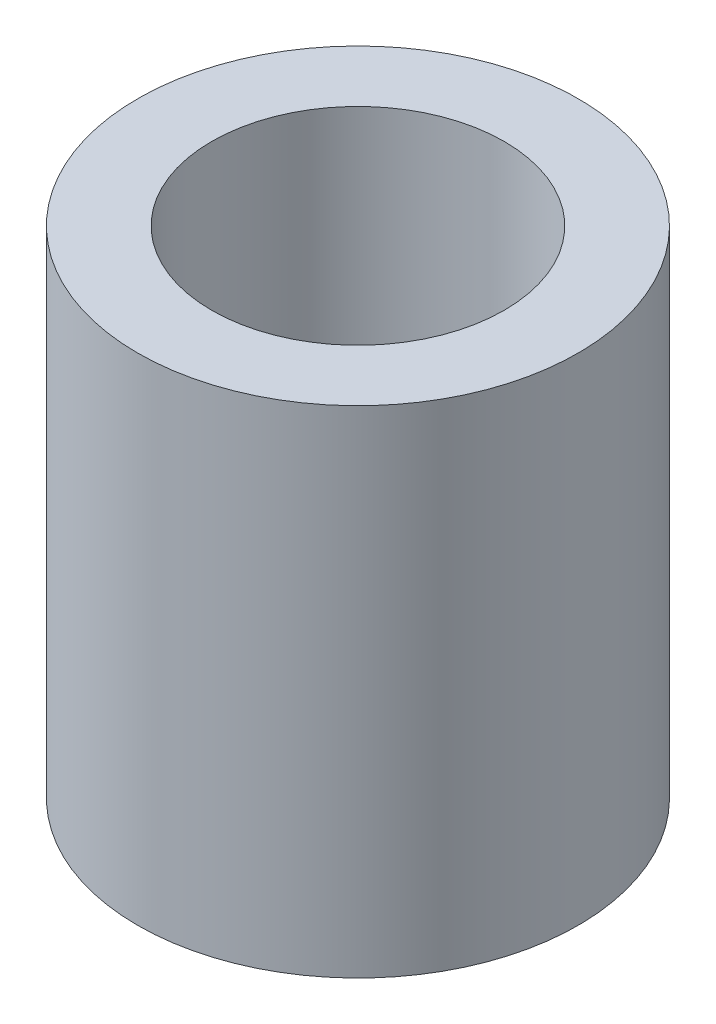
ISO-10303-21;
HEADER;
FILE_DESCRIPTION(('STEP AP214'),'2;1');
FILE_NAME('part.step','',(''),(''),'','','');
FILE_SCHEMA(('AUTOMOTIVE_DESIGN { 1 0 10303 214 1 1 1 1 }'));
ENDSEC;
DATA;
#1=APPLICATION_CONTEXT('core data for automotive mechanical design processes');
#2=APPLICATION_PROTOCOL_DEFINITION('international standard','automotive_design',2000,#1);
#3=PRODUCT_CONTEXT('',#1,'mechanical');
#4=PRODUCT('Part','Part','',(#3));
#5=PRODUCT_RELATED_PRODUCT_CATEGORY('part','',(#4));
#6=PRODUCT_DEFINITION_FORMATION('','',#4);
#7=PRODUCT_DEFINITION_CONTEXT('part definition',#1,'design');
#8=PRODUCT_DEFINITION('design','',#6,#7);
#9=PRODUCT_DEFINITION_SHAPE('','',#8);
#10=(LENGTH_UNIT() NAMED_UNIT(*) SI_UNIT(.MILLI.,.METRE.));
#11=(NAMED_UNIT(*) PLANE_ANGLE_UNIT() SI_UNIT($,.RADIAN.));
#12=(NAMED_UNIT(*) SI_UNIT($,.STERADIAN.) SOLID_ANGLE_UNIT());
#13=UNCERTAINTY_MEASURE_WITH_UNIT(LENGTH_MEASURE(1.E-05),#10,'distance_accuracy_value','');
#14=(GEOMETRIC_REPRESENTATION_CONTEXT(3) GLOBAL_UNCERTAINTY_ASSIGNED_CONTEXT((#13)) GLOBAL_UNIT_ASSIGNED_CONTEXT((#10,
#11,#12)) REPRESENTATION_CONTEXT('',''));
#15=CARTESIAN_POINT('',(0.,0.,0.));
#16=DIRECTION('',(0.,0.,1.));
#17=DIRECTION('',(1.,0.,0.));
#18=AXIS2_PLACEMENT_3D('',#15,#16,#17);
#19=CARTESIAN_POINT('',(0.,7.14375,0.));
#20=DIRECTION('',(0.,1.,0.));
#21=DIRECTION('',(0.,0.,1.));
#22=AXIS2_PLACEMENT_3D('',#19,#20,#21);
#23=PLANE('',#22);
#24=CARTESIAN_POINT('',(0.,7.14375,0.));
#25=DIRECTION('',(0.,1.,0.));
#26=DIRECTION('',(0.,0.,1.));
#27=AXIS2_PLACEMENT_3D('',#24,#25,#26);
#28=CIRCLE('',#27,3.175);
#29=CARTESIAN_POINT('',(0.,7.14375,3.175));
#30=VERTEX_POINT('',#29);
#31=EDGE_CURVE('E10',#30,#30,#28,.T.);
#32=ORIENTED_EDGE('',*,*,#31,.T.);
#33=EDGE_LOOP('',(#32));
#34=FACE_BOUND('',#33,.T.);
#35=CARTESIAN_POINT('',(0.,7.14375,0.));
#36=DIRECTION('',(0.,1.,0.));
#37=DIRECTION('',(0.,0.,1.));
#38=AXIS2_PLACEMENT_3D('',#35,#36,#37);
#39=CIRCLE('',#38,2.1082);
#40=CARTESIAN_POINT('',(0.,7.14375,2.1082));
#41=VERTEX_POINT('',#40);
#42=EDGE_CURVE('E45',#41,#41,#39,.T.);
#43=ORIENTED_EDGE('',*,*,#42,.F.);
#44=EDGE_LOOP('',(#43));
#45=FACE_BOUND('',#44,.T.);
#46=ADVANCED_FACE('F34',(#34,#45),#23,.T.);
#47=CARTESIAN_POINT('',(0.,0.,0.));
#48=DIRECTION('',(0.,1.,0.));
#49=DIRECTION('',(0.,0.,1.));
#50=AXIS2_PLACEMENT_3D('',#47,#48,#49);
#51=PLANE('',#50);
#52=CARTESIAN_POINT('',(0.,0.,0.));
#53=DIRECTION('',(0.,1.,0.));
#54=DIRECTION('',(0.,0.,1.));
#55=AXIS2_PLACEMENT_3D('',#52,#53,#54);
#56=CIRCLE('',#55,3.175);
#57=CARTESIAN_POINT('',(0.,0.,3.175));
#58=VERTEX_POINT('',#57);
#59=EDGE_CURVE('E38',#58,#58,#56,.T.);
#60=ORIENTED_EDGE('',*,*,#59,.F.);
#61=EDGE_LOOP('',(#60));
#62=FACE_BOUND('',#61,.T.);
#63=CARTESIAN_POINT('',(0.,0.,0.));
#64=DIRECTION('',(0.,1.,0.));
#65=DIRECTION('',(0.,0.,1.));
#66=AXIS2_PLACEMENT_3D('',#63,#64,#65);
#67=CIRCLE('',#66,2.1082);
#68=CARTESIAN_POINT('',(0.,0.,2.1082));
#69=VERTEX_POINT('',#68);
#70=EDGE_CURVE('E47',#69,#69,#67,.T.);
#71=ORIENTED_EDGE('',*,*,#70,.T.);
#72=EDGE_LOOP('',(#71));
#73=FACE_BOUND('',#72,.T.);
#74=ADVANCED_FACE('F57',(#62,#73),#51,.F.);
#75=CARTESIAN_POINT('',(0.,7.14375,0.));
#76=DIRECTION('',(0.,-1.,0.));
#77=DIRECTION('',(0.,0.,-1.));
#78=AXIS2_PLACEMENT_3D('',#75,#76,#77);
#79=CYLINDRICAL_SURFACE('',#78,3.175);
#80=ORIENTED_EDGE('',*,*,#31,.F.);
#81=EDGE_LOOP('',(#80));
#82=FACE_BOUND('',#81,.T.);
#83=ORIENTED_EDGE('',*,*,#59,.T.);
#84=EDGE_LOOP('',(#83));
#85=FACE_BOUND('',#84,.T.);
#86=ADVANCED_FACE('F36',(#82,#85),#79,.T.);
#87=CARTESIAN_POINT('',(0.,7.14375,0.));
#88=DIRECTION('',(0.,-1.,0.));
#89=DIRECTION('',(0.,0.,-1.));
#90=AXIS2_PLACEMENT_3D('',#87,#88,#89);
#91=CYLINDRICAL_SURFACE('',#90,2.1082);
#92=ORIENTED_EDGE('',*,*,#42,.T.);
#93=EDGE_LOOP('',(#92));
#94=FACE_BOUND('',#93,.T.);
#95=ORIENTED_EDGE('',*,*,#70,.F.);
#96=EDGE_LOOP('',(#95));
#97=FACE_BOUND('',#96,.T.);
#98=ADVANCED_FACE('F53',(#94,#97),#91,.F.);
#99=CLOSED_SHELL('',(#46,#74,#86,#98));
#100=MANIFOLD_SOLID_BREP('B2',#99);
#101=ADVANCED_BREP_SHAPE_REPRESENTATION('',(#18,#100),#14);
#102=SHAPE_DEFINITION_REPRESENTATION(#9,#101);
ENDSEC;
END-ISO-10303-21;
